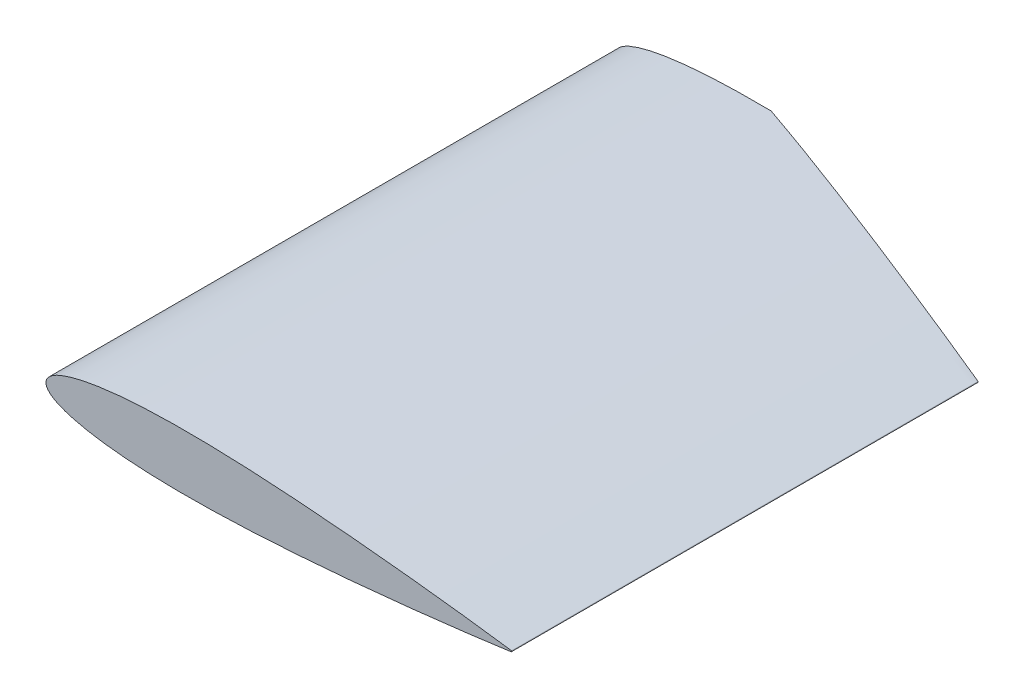
ISO-10303-21;
HEADER;
FILE_DESCRIPTION(('STEP AP214'),'2;1');
FILE_NAME('part.step','',(''),(''),'','','');
FILE_SCHEMA(('AUTOMOTIVE_DESIGN { 1 0 10303 214 1 1 1 1 }'));
ENDSEC;
DATA;
#1=APPLICATION_CONTEXT('core data for automotive mechanical design processes');
#2=APPLICATION_PROTOCOL_DEFINITION('international standard','automotive_design',2000,#1);
#3=PRODUCT_CONTEXT('',#1,'mechanical');
#4=PRODUCT('Part','Part','',(#3));
#5=PRODUCT_RELATED_PRODUCT_CATEGORY('part','',(#4));
#6=PRODUCT_DEFINITION_FORMATION('','',#4);
#7=PRODUCT_DEFINITION_CONTEXT('part definition',#1,'design');
#8=PRODUCT_DEFINITION('design','',#6,#7);
#9=PRODUCT_DEFINITION_SHAPE('','',#8);
#10=(LENGTH_UNIT() NAMED_UNIT(*) SI_UNIT(.MILLI.,.METRE.));
#11=(NAMED_UNIT(*) PLANE_ANGLE_UNIT() SI_UNIT($,.RADIAN.));
#12=(NAMED_UNIT(*) SI_UNIT($,.STERADIAN.) SOLID_ANGLE_UNIT());
#13=UNCERTAINTY_MEASURE_WITH_UNIT(LENGTH_MEASURE(1.E-05),#10,'distance_accuracy_value','');
#14=(GEOMETRIC_REPRESENTATION_CONTEXT(3) GLOBAL_UNCERTAINTY_ASSIGNED_CONTEXT((#13)) GLOBAL_UNIT_ASSIGNED_CONTEXT((#10,
#11,#12)) REPRESENTATION_CONTEXT('',''));
#15=CARTESIAN_POINT('',(0.,0.,0.));
#16=DIRECTION('',(0.,0.,1.));
#17=DIRECTION('',(1.,0.,0.));
#18=AXIS2_PLACEMENT_3D('',#15,#16,#17);
#19=CARTESIAN_POINT('',(0.,0.,279.908));
#20=CARTESIAN_POINT('',(0.,-0.328477994016476,279.908));
#21=CARTESIAN_POINT('',(0.0941325441731211,-1.0023172729545,279.908));
#22=CARTESIAN_POINT('',(0.516328798870607,-1.97904766428281,279.908));
#23=CARTESIAN_POINT('',(1.2062530836688,-2.91908428586532,279.908));
#24=CARTESIAN_POINT('',(2.15553029214511,-3.82650713523624,279.908));
#25=CARTESIAN_POINT('',(3.36108897823794,-4.704503454001,279.908));
#26=CARTESIAN_POINT('',(4.82117378549371,-5.55391213037572,279.908));
#27=CARTESIAN_POINT('',(6.53364786433014,-6.37376807619808,279.908));
#28=CARTESIAN_POINT('',(8.495474964745,-7.16221285278309,279.908));
#29=CARTESIAN_POINT('',(10.702763054413,-7.9168996406346,279.908));
#30=CARTESIAN_POINT('',(13.1508009680241,-8.63530008315857,279.908));
#31=CARTESIAN_POINT('',(15.8342010039548,-9.31470759905576,279.908));
#32=CARTESIAN_POINT('',(18.746872000712,-9.95265574754795,279.908));
#33=CARTESIAN_POINT('',(21.8821858066414,-10.5465238380771,279.908));
#34=CARTESIAN_POINT('',(25.2328944597636,-11.0941511442518,279.908));
#35=CARTESIAN_POINT('',(28.7912646586481,-11.5932902144363,279.908));
#36=CARTESIAN_POINT('',(32.5490198428833,-12.0422559820197,279.908));
#37=CARTESIAN_POINT('',(36.4974269002736,-12.4394447399889,279.908));
#38=CARTESIAN_POINT('',(40.6272789510416,-12.7837513145914,279.908));
#39=CARTESIAN_POINT('',(44.9289529771962,-13.0743792747522,279.908));
#40=CARTESIAN_POINT('',(49.3924277623496,-13.3108406664919,279.908));
#41=CARTESIAN_POINT('',(54.0072816695019,-13.4931883216709,279.908));
#42=CARTESIAN_POINT('',(58.7627401496173,-13.6217631243166,279.908));
#43=CARTESIAN_POINT('',(63.6477053289908,-13.6972676587605,279.908));
#44=CARTESIAN_POINT('',(68.6507801727426,-13.7208707598036,279.908));
#45=CARTESIAN_POINT('',(73.7602795136408,-13.6939838315269,279.908));
#46=CARTESIAN_POINT('',(78.9642730593178,-13.6183651311604,279.908));
#47=CARTESIAN_POINT('',(84.2506096510007,-13.4960636219202,279.908));
#48=CARTESIAN_POINT('',(89.6069569121045,-13.3294041245673,279.908));
#49=CARTESIAN_POINT('',(95.0208042259306,-13.1208208391039,279.908));
#50=CARTESIAN_POINT('',(100.479505937248,-12.8729972701357,279.908));
#51=CARTESIAN_POINT('',(105.970317865327,-12.5887462656741,279.908));
#52=CARTESIAN_POINT('',(111.480424998855,-12.2709314674917,279.908));
#53=CARTESIAN_POINT('',(116.99696065362,-11.9225054491796,279.908));
#54=CARTESIAN_POINT('',(122.507041698154,-11.5464309162635,279.908));
#55=CARTESIAN_POINT('',(127.997806047768,-11.1456605982077,279.908));
#56=CARTESIAN_POINT('',(133.456428211459,-10.7231985761213,279.908));
#57=CARTESIAN_POINT('',(138.870163216828,-10.2818717518472,279.908));
#58=CARTESIAN_POINT('',(144.226358514157,-9.82456304442637,279.908));
#59=CARTESIAN_POINT('',(149.512524458663,-9.35404412678087,279.908));
#60=CARTESIAN_POINT('',(154.716299800482,-8.87302061589386,279.908));
#61=CARTESIAN_POINT('',(159.825543846758,-8.38419190518217,279.908));
#62=CARTESIAN_POINT('',(164.828306857754,-7.89004554213165,279.908));
#63=CARTESIAN_POINT('',(169.71292800753,-7.39314819793037,279.908));
#64=CARTESIAN_POINT('',(174.467978147504,-6.89591580791378,279.908));
#65=CARTESIAN_POINT('',(179.082363680661,-6.40079333268682,279.908));
#66=CARTESIAN_POINT('',(183.545298008656,-5.91018942974059,279.908));
#67=CARTESIAN_POINT('',(187.846354056406,-5.426302321017,279.908));
#68=CARTESIAN_POINT('',(191.975503596944,-4.95159079608177,279.908));
#69=CARTESIAN_POINT('',(195.92309473637,-4.48826239760994,279.908));
#70=CARTESIAN_POINT('',(199.679907253226,-4.03859351271151,279.908));
#71=CARTESIAN_POINT('',(203.23715632793,-3.60479978327037,279.908));
#72=CARTESIAN_POINT('',(206.586548752711,-3.18915507911661,279.908));
#73=CARTESIAN_POINT('',(209.720252988558,-2.79375491607679,279.908));
#74=CARTESIAN_POINT('',(212.630956022205,-2.42081086327762,279.908));
#75=CARTESIAN_POINT('',(215.311847817203,-2.07224105422639,279.908));
#76=CARTESIAN_POINT('',(217.756675720222,-1.75016863484946,279.908));
#77=CARTESIAN_POINT('',(219.959752272128,-1.45638360001213,279.908));
#78=CARTESIAN_POINT('',(221.91584559381,-1.19254519364725,279.908));
#79=CARTESIAN_POINT('',(223.620666071263,-0.960790621537402,279.908));
#80=CARTESIAN_POINT('',(225.069395853676,-0.760875596409357,279.908));
#81=CARTESIAN_POINT('',(226.261037982805,-0.598983786818424,279.908));
#82=CARTESIAN_POINT('',(227.186433997488,-0.462932703818933,279.908));
#83=CARTESIAN_POINT('',(227.85890667084,-0.385743814996746,279.908));
#84=CARTESIAN_POINT('',(228.245225393115,-0.302214543061352,279.908));
#85=CARTESIAN_POINT('',(228.641481893181,-0.309763382509555,279.908));
#86=CARTESIAN_POINT('',(228.641481893181,0.309763382513072,279.908));
#87=CARTESIAN_POINT('',(228.245225393115,0.302214543064814,279.908));
#88=CARTESIAN_POINT('',(227.85890667084,0.385743815000233,279.908));
#89=CARTESIAN_POINT('',(227.186433997488,0.462932703822383,279.908));
#90=CARTESIAN_POINT('',(226.261037982805,0.598983786821878,279.908));
#91=CARTESIAN_POINT('',(225.069395853676,0.760875596412778,279.908));
#92=CARTESIAN_POINT('',(223.620666071263,0.960790621540818,279.908));
#93=CARTESIAN_POINT('',(221.91584559381,1.19254519365062,279.908));
#94=CARTESIAN_POINT('',(219.959752272128,1.45638360001549,279.908));
#95=CARTESIAN_POINT('',(217.756675720222,1.75016863485277,279.908));
#96=CARTESIAN_POINT('',(215.311847817203,2.07224105422966,279.908));
#97=CARTESIAN_POINT('',(212.630956022205,2.42081086328087,279.908));
#98=CARTESIAN_POINT('',(209.720252988558,2.79375491607998,279.908));
#99=CARTESIAN_POINT('',(206.586548752711,3.18915507911975,279.908));
#100=CARTESIAN_POINT('',(203.23715632793,3.60479978327347,279.908));
#101=CARTESIAN_POINT('',(199.679907253226,4.03859351271456,279.908));
#102=CARTESIAN_POINT('',(195.92309473637,4.48826239761293,279.908));
#103=CARTESIAN_POINT('',(191.975503596944,4.9515907960847,279.908));
#104=CARTESIAN_POINT('',(187.846354056406,5.42630232101987,279.908));
#105=CARTESIAN_POINT('',(183.545298008656,5.91018942974339,279.908));
#106=CARTESIAN_POINT('',(179.082363680661,6.40079333268955,279.908));
#107=CARTESIAN_POINT('',(174.467978147504,6.89591580791643,279.908));
#108=CARTESIAN_POINT('',(169.71292800753,7.39314819793296,279.908));
#109=CARTESIAN_POINT('',(164.828306857754,7.89004554213415,279.908));
#110=CARTESIAN_POINT('',(159.825543846758,8.3841919051846,279.908));
#111=CARTESIAN_POINT('',(154.716299800482,8.87302061589623,279.908));
#112=CARTESIAN_POINT('',(149.512524458662,9.35404412678314,279.908));
#113=CARTESIAN_POINT('',(144.226358514157,9.82456304442856,279.908));
#114=CARTESIAN_POINT('',(138.870163216828,10.2818717518493,279.908));
#115=CARTESIAN_POINT('',(133.456428211459,10.7231985761234,279.908));
#116=CARTESIAN_POINT('',(127.997806047768,11.1456605982096,279.908));
#117=CARTESIAN_POINT('',(122.507041698154,11.5464309162653,279.908));
#118=CARTESIAN_POINT('',(116.996960653619,11.9225054491814,279.908));
#119=CARTESIAN_POINT('',(111.480424998854,12.2709314674934,279.908));
#120=CARTESIAN_POINT('',(105.970317865327,12.5887462656757,279.908));
#121=CARTESIAN_POINT('',(100.479505937248,12.8729972701372,279.908));
#122=CARTESIAN_POINT('',(95.0208042259304,13.1208208391053,279.908));
#123=CARTESIAN_POINT('',(89.6069569121043,13.3294041245687,279.908));
#124=CARTESIAN_POINT('',(84.2506096510005,13.4960636219214,279.908));
#125=CARTESIAN_POINT('',(78.9642730593176,13.6183651311616,279.908));
#126=CARTESIAN_POINT('',(73.7602795136406,13.693983831528,279.908));
#127=CARTESIAN_POINT('',(68.6507801727424,13.7208707598047,279.908));
#128=CARTESIAN_POINT('',(63.6477053289906,13.6972676587614,279.908));
#129=CARTESIAN_POINT('',(58.7627401496171,13.6217631243175,279.908));
#130=CARTESIAN_POINT('',(54.0072816695016,13.4931883216718,279.908));
#131=CARTESIAN_POINT('',(49.3924277623495,13.3108406664926,279.908));
#132=CARTESIAN_POINT('',(44.928952977196,13.0743792747529,279.908));
#133=CARTESIAN_POINT('',(40.6272789510414,12.783751314592,279.908));
#134=CARTESIAN_POINT('',(36.4974269002734,12.4394447399895,279.908));
#135=CARTESIAN_POINT('',(32.5490198428832,12.0422559820202,279.908));
#136=CARTESIAN_POINT('',(28.7912646586479,11.5932902144368,279.908));
#137=CARTESIAN_POINT('',(25.2328944597635,11.0941511442522,279.908));
#138=CARTESIAN_POINT('',(21.8821858066412,10.5465238380774,279.908));
#139=CARTESIAN_POINT('',(18.7468720007118,9.95265574754821,279.908));
#140=CARTESIAN_POINT('',(15.8342010039546,9.31470759905599,279.908));
#141=CARTESIAN_POINT('',(13.150800968024,8.63530008315877,279.908));
#142=CARTESIAN_POINT('',(10.7027630544128,7.91689964063473,279.908));
#143=CARTESIAN_POINT('',(8.49547496474492,7.16221285278321,279.908));
#144=CARTESIAN_POINT('',(6.53364786433,6.37376807619818,279.908));
#145=CARTESIAN_POINT('',(4.82117378549363,5.55391213037578,279.908));
#146=CARTESIAN_POINT('',(3.36108897823788,4.70450345400106,279.908));
#147=CARTESIAN_POINT('',(2.15553029214511,3.8265071352363,279.908));
#148=CARTESIAN_POINT('',(1.20625308366877,2.9190842858653,279.908));
#149=CARTESIAN_POINT('',(0.516328798870579,1.97904766428281,279.908));
#150=CARTESIAN_POINT('',(0.094132544173121,1.00231727295449,279.908));
#151=CARTESIAN_POINT('',(0.,0.328477994016488,279.908));
#152=CARTESIAN_POINT('',(0.,0.,279.908));
#153=B_SPLINE_CURVE_WITH_KNOTS('',3,(#19,#20,#21,#22,#23,#24,#25,#26,#27,#28,#29,#30,#31,#32,
#33,#34,#35,#36,#37,#38,#39,#40,#41,#42,#43,#44,#45,#46,#47,#48,#49,#50,#51,#52,#53,#54,#55,#56,
#57,#58,#59,#60,#61,#62,#63,#64,#65,#66,#67,#68,#69,#70,#71,#72,#73,#74,#75,#76,#77,#78,#79,#80,
#81,#82,#83,#84,#85,#86,#87,#88,#89,#90,#91,#92,#93,#94,#95,#96,#97,#98,#99,#100,#101,#102,#103,
#104,#105,#106,#107,#108,#109,#110,#111,#112,#113,#114,#115,#116,#117,#118,#119,#120,#121,#122,
#123,#124,#125,#126,#127,#128,#129,#130,#131,#132,#133,#134,#135,#136,#137,#138,#139,#140,#141,
#142,#143,#144,#145,#146,#147,#148,#149,#150,#151,#152),.UNSPECIFIED.,.T.,.F.,(4,1,1,1,1,1,1,1,
1,1,1,1,1,1,1,1,1,1,1,1,1,1,1,1,1,1,1,1,1,1,1,1,1,1,1,1,1,1,1,1,1,1,1,1,1,1,1,1,1,1,1,1,1,1,1,1,
1,1,1,1,1,1,1,1,1,1,1,1,1,1,1,1,1,1,1,1,1,1,1,1,1,1,1,1,1,1,1,1,1,1,1,1,1,1,1,1,1,1,1,1,1,1,1,1,
1,1,1,1,1,1,1,1,1,1,1,1,1,1,1,1,1,1,1,1,1,1,1,1,1,1,1,4),(0.,0.00210616807074115,
0.00432059011551111,0.00677278324255004,0.0095566969740557,0.0127340412762951,0.016342887665016,
0.0204056041416188,0.0249341021959062,0.0299330711387399,0.0354022405625184,0.0413374297387623,
0.0477315899593609,0.0545753893368606,0.0618574049639954,0.0695645708943233,0.0776823107915671,
0.0861946839628209,0.0950844406286816,0.104333244082668,0.11392170016525,0.123829338817381,
0.134034707587743,0.144515530837606,0.155248716244455,0.166210355911424,0.177375782785101,
0.188719821086083,0.200216647190567,0.211839950659802,0.223562989450439,0.235358652726913,
0.247199624742581,0.259058395239763,0.270907226000352,0.28271845684065,0.294464514017973,
0.306117689175103,0.317650770640405,0.329036618137891,0.340248510387813,0.351259999107984,
0.362045273287995,0.372578891011839,0.382836142378724,0.392792739452293,0.402425320157517,
0.411711114815343,0.420628244391039,0.429155672678663,0.437273179489273,0.444961560956889,
0.452202574975458,0.458979062595132,0.465274875652064,0.471074962819879,0.4763655692602,
0.481133960582339,0.485368767772863,0.489059784178549,0.492198147958178,0.494776266124308,
0.496788010026555,0.49822842540793,0.499094072926926,0.499382862053181,0.500617137946819,
0.500905927073075,0.50177157459207,0.503211989973446,0.505223733875692,0.507801852041822,
0.510940215821451,0.514631232227138,0.518866039417661,0.5236344307398,0.528925037180122,
0.534725124347937,0.541020937404868,0.547797425024542,0.555038439043111,0.562726820510727,
0.570844327321338,0.579371755608962,0.588288885184657,0.597574679842483,0.607207260547707,
0.617163857621276,0.627421108988161,0.637954726712006,0.648740000892016,0.659751489612187,
0.670963381862109,0.682349229359595,0.693882310824897,0.705535485982027,0.717281543159351,
0.729092773999648,0.740941604760238,0.752800375257419,0.764641347273087,0.776437010549561,
0.788160049340198,0.799783352809433,0.811280178913917,0.822624217214899,0.833789644088576,
0.844751283755546,0.855484469162394,0.865965292412258,0.876170661182619,0.88607829983475,
0.895666755917333,0.904915559371319,0.913805316037179,0.922317689208433,0.930435429105677,
0.938142595036005,0.94542461066314,0.952268410040639,0.958662570261238,0.964597759437482,
0.97006692886126,0.975065897804094,0.979594395858381,0.983657112334984,0.987265958723705,
0.990443303025944,0.99322721675745,0.995679409884489,0.997893831929259,1.),.UNSPECIFIED.);
#154=DIRECTION('',(0.,0.,-1.));
#155=VECTOR('',#154,1.);
#156=SURFACE_OF_LINEAR_EXTRUSION('',#153,#155);
#157=CARTESIAN_POINT('',(0.,0.,279.908));
#158=VERTEX_POINT('',#157);
#159=EDGE_CURVE('E11',#158,#158,#153,.T.);
#160=ORIENTED_EDGE('',*,*,#159,.F.);
#161=EDGE_LOOP('',(#160));
#162=FACE_BOUND('',#161,.T.);
#163=CARTESIAN_POINT('',(76.1999999999999,-13.6565628102421,0.));
#164=CARTESIAN_POINT('',(77.208840666088,-13.6422333763701,0.336280222029334));
#165=CARTESIAN_POINT('',(78.2176454511476,-13.625283053911,0.672548483715867));
#166=CARTESIAN_POINT('',(80.2351660077787,-13.5863996079713,1.34505533592625));
#167=CARTESIAN_POINT('',(81.2438817795875,-13.5644664981958,1.68129392652917));
#168=CARTESIAN_POINT('',(84.2698417804683,-13.4915821819853,2.68994726015614));
#169=CARTESIAN_POINT('',(86.2869349438838,-13.4335454551973,3.36231164796129));
#170=CARTESIAN_POINT('',(90.3199423603291,-13.3003887923855,4.70664745344305));
#171=CARTESIAN_POINT('',(92.3358567829152,-13.225274479899,5.37861892763841));
#172=CARTESIAN_POINT('',(96.3671178610413,-13.0595174609881,6.72237262034712));
#173=CARTESIAN_POINT('',(98.3824645138563,-12.9688746812659,7.39415483795213));
#174=CARTESIAN_POINT('',(102.412271061332,-12.7734622632592,8.73742368711053));
#175=CARTESIAN_POINT('',(104.426731038136,-12.6686944996075,9.40891034604533));
#176=CARTESIAN_POINT('',(108.455009599191,-12.4462142902764,10.751669866397));
#177=CARTESIAN_POINT('',(110.468828181584,-12.3285018074345,11.4229427271946));
#178=CARTESIAN_POINT('',(116.509179769497,-11.9575825032013,13.4363932564991));
#179=CARTESIAN_POINT('',(120.534736152306,-11.6865875009648,14.778245384102));
#180=CARTESIAN_POINT('',(128.583244433655,-11.104170990864,17.4610814778849));
#181=CARTESIAN_POINT('',(132.606196292894,-10.7927488866371,18.8020654309647));
#182=CARTESIAN_POINT('',(140.647518428989,-10.1348177282568,21.4825061429963));
#183=CARTESIAN_POINT('',(144.665889986617,-9.78832603770965,22.8219633288723));
#184=CARTESIAN_POINT('',(150.691618125074,-9.24494154838238,24.8305393750247));
#185=CARTESIAN_POINT('',(152.699942277845,-9.05986703043822,25.4999807592816));
#186=CARTESIAN_POINT('',(156.715952077228,-8.68217531265046,26.8386506924094));
#187=CARTESIAN_POINT('',(158.723637723845,-8.48955811285208,27.5078792412817));
#188=CARTESIAN_POINT('',(164.745848138022,-7.90076942791547,29.515282712674));
#189=CARTESIAN_POINT('',(168.759417169468,-7.49367073580834,30.8531390564892));
#190=CARTESIAN_POINT('',(174.777777238214,-6.86211008095231,32.8592590794047));
#191=CARTESIAN_POINT('',(176.783563264592,-6.64810462250083,33.5278544215308));
#192=CARTESIAN_POINT('',(180.794459537586,-6.21317182808128,34.864819845862));
#193=CARTESIAN_POINT('',(182.799569784735,-5.99224449759606,35.5331899282451));
#194=CARTESIAN_POINT('',(186.809012361799,-5.54341690293842,36.8696707872664));
#195=CARTESIAN_POINT('',(188.813344717737,-5.31551689689992,37.5377815725789));
#196=CARTESIAN_POINT('',(192.821278678686,-4.8526979416782,38.873759559562));
#197=CARTESIAN_POINT('',(194.824880284422,-4.61777899947017,39.5416267614741));
#198=CARTESIAN_POINT('',(197.711818692563,-4.27403452151866,40.5039395641875));
#199=CARTESIAN_POINT('',(198.595467037055,-4.16810963129345,40.7984890123515));
#200=CARTESIAN_POINT('',(200.362603092899,-3.95483913933565,41.3875343642996));
#201=CARTESIAN_POINT('',(201.246090805357,-3.84749354778988,41.6820302684522));
#202=CARTESIAN_POINT('',(203.012910870883,-3.63137330523459,42.2709702902942));
#203=CARTESIAN_POINT('',(203.896243223604,-3.52259865107481,42.565414407868));
#204=CARTESIAN_POINT('',(205.662746929352,-3.30359201490094,43.1542489764506));
#205=CARTESIAN_POINT('',(206.545918282085,-3.19336003025714,43.4486394273616));
#206=CARTESIAN_POINT('',(208.607848038132,-2.93425428063051,44.1359493460437));
#207=CARTESIAN_POINT('',(209.78654118152,-2.784803095191,44.5288470605068));
#208=CARTESIAN_POINT('',(212.143615559526,-2.4831966899373,45.314538519842));
#209=CARTESIAN_POINT('',(213.321996794298,-2.33104147147488,45.7073322647661));
#210=CARTESIAN_POINT('',(215.286173951022,-2.07507737679268,46.3620579836741));
#211=CARTESIAN_POINT('',(216.072060152018,-1.9720376059638,46.6240200506727));
#212=CARTESIAN_POINT('',(217.643686099765,-1.76472471940942,47.1478953665884));
#213=CARTESIAN_POINT('',(218.429425846538,-1.66045160386557,47.4098086155126));
#214=CARTESIAN_POINT('',(219.73895491094,-1.48553883842829,47.8463183036466));
#215=CARTESIAN_POINT('',(220.262788767302,-1.41526953047994,48.0209295891007));
#216=CARTESIAN_POINT('',(221.310390785502,-1.27418561286308,48.370130261834));
#217=CARTESIAN_POINT('',(221.834158947285,-1.20337100274243,48.5447196490949));
#218=CARTESIAN_POINT('',(222.707007391959,-1.08493931904569,48.8356691306531));
#219=CARTESIAN_POINT('',(223.056104494545,-1.03746022659085,48.9520348315149));
#220=CARTESIAN_POINT('',(223.754235500923,-0.942002182192941,49.1847451669742));
#221=CARTESIAN_POINT('',(224.103269405002,-0.894023232577651,49.3010898016673));
#222=CARTESIAN_POINT('',(224.684926838106,-0.814086306894115,49.494975612702));
#223=CARTESIAN_POINT('',(224.917549603426,-0.782122114268486,49.5725165344754));
#224=CARTESIAN_POINT('',(225.382830778411,-0.718452920805785,49.7276102594702));
#225=CARTESIAN_POINT('',(225.615489188579,-0.686747924058714,49.8051630628595));
#226=CARTESIAN_POINT('',(226.003083371146,-0.633224553023536,49.9343611237153));
#227=CARTESIAN_POINT('',(226.15804761288,-0.611637506393094,49.9860158709601));
#228=CARTESIAN_POINT('',(226.467866160496,-0.567679065661751,50.0892887201654));
#229=CARTESIAN_POINT('',(226.622720472554,-0.545307719891686,50.1409068241847));
#230=CARTESIAN_POINT('',(226.829272525194,-0.516080290116077,50.209757508398));
#231=CARTESIAN_POINT('',(226.880918966183,-0.508823270425826,50.2269729887277));
#232=CARTESIAN_POINT('',(226.984233421107,-0.494484149451267,50.2614111403688));
#233=CARTESIAN_POINT('',(227.035901434916,-0.487402047165571,50.2786338116386));
#234=CARTESIAN_POINT('',(227.139276078933,-0.473465131854073,50.3130920263109));
#235=CARTESIAN_POINT('',(227.190982714902,-0.466610365936756,50.330327571634));
#236=CARTESIAN_POINT('',(227.294435194721,-0.453237159809118,50.3648117315738));
#237=CARTESIAN_POINT('',(227.346181038771,-0.446718721318177,50.382060346257));
#238=CARTESIAN_POINT('',(227.432228730006,-0.435894960614488,50.4107429100019));
#239=CARTESIAN_POINT('',(227.466530001711,-0.431584420764409,50.4221766672369));
#240=CARTESIAN_POINT('',(227.535118244768,-0.422839930331956,50.4450394149226));
#241=CARTESIAN_POINT('',(227.569405216114,-0.418405979701031,50.4564684053715));
#242=CARTESIAN_POINT('',(227.672184270711,-0.404753119596681,50.4907280902372));
#243=CARTESIAN_POINT('',(227.740635897022,-0.395178283909059,50.5135452990073));
#244=CARTESIAN_POINT('',(227.855032924966,-0.377487366197331,50.5516776416553));
#245=CARTESIAN_POINT('',(227.901051782002,-0.36991088444401,50.5670172606675));
#246=CARTESIAN_POINT('',(227.992954500605,-0.35358182121007,50.5976515002018));
#247=CARTESIAN_POINT('',(228.038838140671,-0.344827871388667,50.6129460468904));
#248=CARTESIAN_POINT('',(228.115823317597,-0.331360190155136,50.6386077725325));
#249=CARTESIAN_POINT('',(228.146862046987,-0.326260282502573,50.6489540156623));
#250=CARTESIAN_POINT('',(228.209047004748,-0.317435451264139,50.669682334916));
#251=CARTESIAN_POINT('',(228.240192753138,-0.313707034218769,50.6800642510461));
#252=CARTESIAN_POINT('',(228.280995417128,-0.31013985966804,50.6936651390425));
#253=CARTESIAN_POINT('',(228.290582688591,-0.309396354272701,50.6968608961971));
#254=CARTESIAN_POINT('',(228.309768199644,-0.308101827986706,50.7032560665481));
#255=CARTESIAN_POINT('',(228.319366437671,-0.307550782454564,50.7064554792236));
#256=CARTESIAN_POINT('',(228.338611625414,-0.306693759487192,50.7128705418045));
#257=CARTESIAN_POINT('',(228.348258613477,-0.306388796296355,50.7160862044923));
#258=CARTESIAN_POINT('',(228.367553840502,-0.305820489108642,50.722517946834));
#259=CARTESIAN_POINT('',(228.377202079499,-0.305557146827256,50.7257340264998));
#260=CARTESIAN_POINT('',(228.398580775815,-0.304554059674235,50.732860258605));
#261=CARTESIAN_POINT('',(228.410308427668,-0.30372328080771,50.7367694758895));
#262=CARTESIAN_POINT('',(228.43357670037,-0.300703128041631,50.7445255667899));
#263=CARTESIAN_POINT('',(228.445118029402,-0.298522189846027,50.7483726764675));
#264=CARTESIAN_POINT('',(228.464386424908,-0.292689237949018,50.7547954749692));
#265=CARTESIAN_POINT('',(228.47226415437,-0.289632602445448,50.7574213847899));
#266=CARTESIAN_POINT('',(228.487338168823,-0.282004686824539,50.7624460562743));
#267=CARTESIAN_POINT('',(228.494534250587,-0.277432956812174,50.7648447501957));
#268=CARTESIAN_POINT('',(228.508054114492,-0.267127915226009,50.7693513714973));
#269=CARTESIAN_POINT('',(228.514382518338,-0.26140119446391,50.7714608394461));
#270=CARTESIAN_POINT('',(228.526198817587,-0.249044771703372,50.7753996058623));
#271=CARTESIAN_POINT('',(228.531685050339,-0.242413331079536,50.7772283501129));
#272=CARTESIAN_POINT('',(228.545267011796,-0.223840004856945,50.7817556705988));
#273=CARTESIAN_POINT('',(228.552646340867,-0.211318477334253,50.7842154469556));
#274=CARTESIAN_POINT('',(228.565529280599,-0.185229332976911,50.7885097601997));
#275=CARTESIAN_POINT('',(228.571024928385,-0.171657565458602,50.790341642795));
#276=CARTESIAN_POINT('',(228.584280159487,-0.132641956051129,50.7947600531623));
#277=CARTESIAN_POINT('',(228.590243746039,-0.106522938535659,50.7967479153465));
#278=CARTESIAN_POINT('',(228.598110856215,-0.0536032831325101,50.799370285405));
#279=CARTESIAN_POINT('',(228.60000090948,-0.0268006794385224,50.8000003031601));
#280=CARTESIAN_POINT('',(228.599999151841,0.0249936502658953,50.7999997172804));
#281=CARTESIAN_POINT('',(228.598353739826,0.0499856270133849,50.7994512466088));
#282=CARTESIAN_POINT('',(228.591541306871,0.099389634042865,50.7971804356238));
#283=CARTESIAN_POINT('',(228.586387783343,0.123803517322018,50.7954625944475));
#284=CARTESIAN_POINT('',(228.575125354313,0.160270466765427,50.7917084514375));
#285=CARTESIAN_POINT('',(228.570543655207,0.172848411869609,50.7901812184022));
#286=CARTESIAN_POINT('',(228.559894799591,0.197274451085241,50.7866315998636));
#287=CARTESIAN_POINT('',(228.553831346166,0.209124273871863,50.7846104487221));
#288=CARTESIAN_POINT('',(228.541463326275,0.229179952627646,50.780487775425));
#289=CARTESIAN_POINT('',(228.535499950574,0.237616794854434,50.7784999835247));
#290=CARTESIAN_POINT('',(228.522384163456,0.25339898829607,50.7741280544854));
#291=CARTESIAN_POINT('',(228.515233602208,0.260746004731027,50.7717445340689));
#292=CARTESIAN_POINT('',(228.501034154246,0.272765195390341,50.7670113847486));
#293=CARTESIAN_POINT('',(228.494172922037,0.27767962975641,50.7647243073462));
#294=CARTESIAN_POINT('',(228.483359783279,0.28401808953392,50.7611199277595));
#295=CARTESIAN_POINT('',(228.479674777169,0.285956450748664,50.759891592389));
#296=CARTESIAN_POINT('',(228.472150396362,0.28946871888315,50.7573834654546));
#297=CARTESIAN_POINT('',(228.468310980789,0.291042528539457,50.7561036602649));
#298=CARTESIAN_POINT('',(228.458675444279,0.294530122112458,50.7528918147626));
#299=CARTESIAN_POINT('',(228.45281667935,0.296249945834225,50.7509388931173));
#300=CARTESIAN_POINT('',(228.44097650858,0.299120405628172,50.746992169526));
#301=CARTESIAN_POINT('',(228.434995013927,0.300270613194885,50.7449983379754));
#302=CARTESIAN_POINT('',(228.422908951763,0.302157220222232,50.7409696505879));
#303=CARTESIAN_POINT('',(228.416803754392,0.3028889194981,50.7389345847973));
#304=CARTESIAN_POINT('',(228.404568959953,0.304053016016183,50.7348563199842));
#305=CARTESIAN_POINT('',(228.398439360501,0.3044853832587,50.732813120167));
#306=CARTESIAN_POINT('',(228.382607710774,0.305361849938137,50.7275359035914));
#307=CARTESIAN_POINT('',(228.372899702542,0.305666743287848,50.7242999008474));
#308=CARTESIAN_POINT('',(228.353482628381,0.306239413538377,50.7178275427938));
#309=CARTESIAN_POINT('',(228.343773562455,0.306507186304697,50.714591187485));
#310=CARTESIAN_POINT('',(228.324371315524,0.307294912157175,50.7081237718413));
#311=CARTESIAN_POINT('',(228.314678128029,0.307814665738577,50.7048927093431));
#312=CARTESIAN_POINT('',(228.295303295697,0.309053244069,50.6984344318989));
#313=CARTESIAN_POINT('',(228.285621651525,0.30977207980916,50.6952072171751));
#314=CARTESIAN_POINT('',(228.256610247764,0.312218391566469,50.6855367492546));
#315=CARTESIAN_POINT('',(228.237302049034,0.314236200190707,50.6791006830115));
#316=CARTESIAN_POINT('',(228.19890127794,0.318881518498393,50.6663004259799));
#317=CARTESIAN_POINT('',(228.179808176353,0.321504325684572,50.6599360587843));
#318=CARTESIAN_POINT('',(228.141662519093,0.327216594837979,50.6472208396977));
#319=CARTESIAN_POINT('',(228.122610039322,0.330306611693899,50.6408700131072));
#320=CARTESIAN_POINT('',(228.084539360946,0.33678626830337,50.6281797869821));
#321=CARTESIAN_POINT('',(228.065521192496,0.340176100607759,50.6218403974985));
#322=CARTESIAN_POINT('',(228.00848385936,0.350516055672115,50.60282795312));
#323=CARTESIAN_POINT('',(227.970492104566,0.357634905074791,50.5901640348553));
#324=CARTESIAN_POINT('',(227.894395908249,0.370999217692253,50.5647986360832));
#325=CARTESIAN_POINT('',(227.856291563216,0.377245283537614,50.5520971877388));
#326=CARTESIAN_POINT('',(227.780006842222,0.389126865364915,50.5266689474073));
#327=CARTESIAN_POINT('',(227.741826482384,0.394762499154743,50.5139421607947));
#328=CARTESIAN_POINT('',(227.665316569206,0.405593248297943,50.4884388564018));
#329=CARTESIAN_POINT('',(227.626986877707,0.410787274109961,50.475662292569));
#330=CARTESIAN_POINT('',(227.550285911943,0.420900644800552,50.450095303981));
#331=CARTESIAN_POINT('',(227.511914629839,0.425819922659009,50.437304876613));
#332=CARTESIAN_POINT('',(227.43515558862,0.435540024099993,50.41171852954));
#333=CARTESIAN_POINT('',(227.396767828433,0.440340838186904,50.3989226094777));
#334=CARTESIAN_POINT('',(227.300895641824,0.452437516311237,50.3669652139414));
#335=CARTESIAN_POINT('',(227.243417075064,0.459785810107771,50.3478056916881));
#336=CARTESIAN_POINT('',(227.128510516743,0.474873929116894,50.309503505581));
#337=CARTESIAN_POINT('',(227.071082521743,0.482613725219695,50.2903608405811));
#338=CARTESIAN_POINT('',(226.956293438624,0.498330263448775,50.2520978128746));
#339=CARTESIAN_POINT('',(226.898932331218,0.5063068503146,50.2329774437393));
#340=CARTESIAN_POINT('',(226.784229823702,0.522427346889305,50.1947432745673));
#341=CARTESIAN_POINT('',(226.726888424137,0.530571260899631,50.1756294747123));
#342=CARTESIAN_POINT('',(226.554861197174,0.55510680627651,50.1182870657248));
#343=CARTESIAN_POINT('',(226.440188425974,0.57159998558227,50.080062808658));
#344=CARTESIAN_POINT('',(226.210788784046,0.604162058612439,50.0035962613485));
#345=CARTESIAN_POINT('',(226.096061913424,0.620230953175341,49.9653539711414));
#346=CARTESIAN_POINT('',(225.866577646416,0.652113899028559,49.8888592154722));
#347=CARTESIAN_POINT('',(225.751820250343,0.667927952835955,49.8506067501142));
#348=CARTESIAN_POINT('',(225.522288405313,0.6994198148497,49.7740961351043));
#349=CARTESIAN_POINT('',(225.407513956321,0.715097622767006,49.7358379854404));
#350=CARTESIAN_POINT('',(225.063131846112,0.762197149603533,49.6210439487041));
#351=CARTESIAN_POINT('',(224.833531225947,0.793676016255905,49.5445104086489));
#352=CARTESIAN_POINT('',(224.374344326289,0.856754979166768,49.3914481087629));
#353=CARTESIAN_POINT('',(224.144758046838,0.88835507576379,49.314919348946));
#354=CARTESIAN_POINT('',(223.609056641789,0.961882687442321,49.1363522139297));
#355=CARTESIAN_POINT('',(223.30293317096,1.00374272056786,49.0343110569867));
#356=CARTESIAN_POINT('',(222.690649895711,1.08716638386971,48.8302166319038));
#357=CARTESIAN_POINT('',(222.384490091288,1.12873001401893,48.7281633637627));
#358=CARTESIAN_POINT('',(221.46598241738,1.25318298532353,48.4219941391267));
#359=CARTESIAN_POINT('',(220.853605527214,1.33583451111798,48.2178685090712));
#360=CARTESIAN_POINT('',(219.628754855742,1.50033380315013,47.8095849519142));
#361=CARTESIAN_POINT('',(219.016281074484,1.58218156976781,47.605427024828));
#362=CARTESIAN_POINT('',(217.79131396564,1.74508340442139,47.1971046552134));
#363=CARTESIAN_POINT('',(217.178820649421,1.82613756745335,46.9929402164738));
#364=CARTESIAN_POINT('',(215.953744541076,1.98749449131897,46.5845815136921));
#365=CARTESIAN_POINT('',(215.341161748895,2.06779725168343,46.3803872496316));
#366=CARTESIAN_POINT('',(214.115908408472,2.22765911475835,45.9719694694908));
#367=CARTESIAN_POINT('',(213.50323786016,2.30721821685518,45.7677459533867));
#368=CARTESIAN_POINT('',(210.439536463257,2.70317068683599,44.746512154419));
#369=CARTESIAN_POINT('',(207.987854225289,3.01398328954183,43.9292847417629));
#370=CARTESIAN_POINT('',(203.08322535456,3.6243838472541,42.2944084515199));
#371=CARTESIAN_POINT('',(200.630278717034,3.92397175963544,41.4767595723445));
#372=CARTESIAN_POINT('',(195.723207937525,4.51227563883308,39.8410693125083));
#373=CARTESIAN_POINT('',(193.269083793446,4.80099158622105,39.0230279311488));
#374=CARTESIAN_POINT('',(188.359254356974,5.36794901838436,37.3864181189914));
#375=CARTESIAN_POINT('',(185.903548847436,5.6461884128607,36.5678496158119));
#376=CARTESIAN_POINT('',(180.991096571267,6.19221056516476,34.9303655237557));
#377=CARTESIAN_POINT('',(178.53434980673,6.459993343908,34.1114499355767));
#378=CARTESIAN_POINT('',(173.619863065563,6.98516132221422,32.473287688521));
#379=CARTESIAN_POINT('',(171.162123091314,7.2425465465494,31.6540410304379));
#380=CARTESIAN_POINT('',(164.96282584935,7.87828003992437,29.5876086164499));
#381=CARTESIAN_POINT('',(161.220622918014,8.24965931218091,28.3402076393379));
#382=CARTESIAN_POINT('',(153.733973802635,8.96669689666321,25.8446579342117));
#383=CARTESIAN_POINT('',(149.989527604155,9.31235504152185,24.5965092013851));
#384=CARTESIAN_POINT('',(142.498298922494,9.97574364512776,22.0994329741647));
#385=CARTESIAN_POINT('',(138.751516377668,10.2934733326083,20.8505054592228));
#386=CARTESIAN_POINT('',(131.255442845097,10.897796547276,18.351814281699));
#387=CARTESIAN_POINT('',(127.506151713297,11.1843880979444,17.1020505710991));
#388=CARTESIAN_POINT('',(120.006602202181,11.7219884458587,14.6022007340602));
#389=CARTESIAN_POINT('',(116.25634463995,11.9730098506493,13.3521148799834));
#390=CARTESIAN_POINT('',(108.75357382337,12.4339281547369,10.8511912744567));
#391=CARTESIAN_POINT('',(105.001060601275,12.6438256286885,9.60035353375838));
#392=CARTESIAN_POINT('',(99.3708338229761,12.9223695056394,7.72361127432537));
#393=CARTESIAN_POINT('',(97.4939212400061,13.0091644250029,7.09797374666873));
#394=CARTESIAN_POINT('',(93.7395904897549,13.1695453627249,5.84653016325165));
#395=CARTESIAN_POINT('',(91.8621723243386,13.2431314291548,5.22072410811283));
#396=CARTESIAN_POINT('',(88.1070057694981,13.3758594744565,3.96900192316609));
#397=CARTESIAN_POINT('',(86.2292574120554,13.4350024559183,3.3430858040186));
#398=CARTESIAN_POINT('',(82.4733786174307,13.5374804499361,2.09112620581011));
#399=CARTESIAN_POINT('',(80.5952481833063,13.5808155843726,1.4650827277683));
#400=CARTESIAN_POINT('',(78.2974985723503,13.6231816141904,0.699166190783309));
#401=CARTESIAN_POINT('',(77.878010820683,13.6304819108069,0.559336940227638));
#402=CARTESIAN_POINT('',(77.0390174346263,13.6441939312854,0.279672478208823));
#403=CARTESIAN_POINT('',(76.6195118000867,13.6506056449412,0.13983726669566));
#404=CARTESIAN_POINT('',(76.1999999999999,13.6565628102433,0.));
#405=B_SPLINE_CURVE_WITH_KNOTS('',3,(#163,#164,#165,#166,#167,#168,#169,#170,#171,#172,#173,
#174,#175,#176,#177,#178,#179,#180,#181,#182,#183,#184,#185,#186,#187,#188,#189,#190,#191,#192,
#193,#194,#195,#196,#197,#198,#199,#200,#201,#202,#203,#204,#205,#206,#207,#208,#209,#210,#211,
#212,#213,#214,#215,#216,#217,#218,#219,#220,#221,#222,#223,#224,#225,#226,#227,#228,#229,#230,
#231,#232,#233,#234,#235,#236,#237,#238,#239,#240,#241,#242,#243,#244,#245,#246,#247,#248,#249,
#250,#251,#252,#253,#254,#255,#256,#257,#258,#259,#260,#261,#262,#263,#264,#265,#266,#267,#268,
#269,#270,#271,#272,#273,#274,#275,#276,#277,#278,#279,#280,#281,#282,#283,#284,#285,#286,#287,
#288,#289,#290,#291,#292,#293,#294,#295,#296,#297,#298,#299,#300,#301,#302,#303,#304,#305,#306,
#307,#308,#309,#310,#311,#312,#313,#314,#315,#316,#317,#318,#319,#320,#321,#322,#323,#324,#325,
#326,#327,#328,#329,#330,#331,#332,#333,#334,#335,#336,#337,#338,#339,#340,#341,#342,#343,#344,
#345,#346,#347,#348,#349,#350,#351,#352,#353,#354,#355,#356,#357,#358,#359,#360,#361,#362,#363,
#364,#365,#366,#367,#368,#369,#370,#371,#372,#373,#374,#375,#376,#377,#378,#379,#380,#381,#382,
#383,#384,#385,#386,#387,#388,#389,#390,#391,#392,#393,#394,#395,#396,#397,#398,#399,#400,#401,
#402,#403,#404),.UNSPECIFIED.,.F.,.F.,(4,2,2,2,2,2,2,2,2,2,2,2,2,2,2,2,2,2,2,2,2,2,2,2,2,2,2,2,
2,2,2,2,2,2,2,2,2,2,2,2,2,2,2,2,2,2,2,2,2,2,2,2,2,2,2,2,2,2,2,2,2,2,2,2,2,2,2,2,2,2,2,2,2,2,2,2,
2,2,2,2,2,2,2,2,2,2,2,2,2,2,2,2,2,2,2,2,2,2,2,2,2,2,2,2,2,2,2,2,2,2,2,2,2,2,2,2,2,2,2,2,4),(0.,
3.19051640547499,6.38102403564837,12.7619246600977,19.1407271311768,25.5195597124969,
31.8975465428791,38.2755516839958,51.0311582384657,63.7869529793954,76.5364626997878,
82.9115540297556,89.2866453215001,102.037174520645,108.412427989339,114.787676408302,
121.162689095473,127.537695447572,130.35004676632,133.16237793066,135.974715295593,
138.78705773597,142.541278571917,146.295497531146,148.799838135101,151.304178370204,
152.974046048384,154.643915111323,155.757007972435,156.870095652312,157.611937153844,
158.353790338812,158.848089630897,159.342358516152,159.507123381852,159.671887304067,
159.83668515789,160.001483854112,160.110721967765,160.219960124395,160.438304685091,
160.585579538551,160.733027043764,160.832353686297,160.931425542824,160.961823740552,
160.992218044836,161.022736990382,161.053257193498,161.090404930094,161.127322880451,
161.153733161319,161.180151291542,161.206422731122,161.232745387713,161.276715276469,
161.320868810441,161.400946442122,161.481288470769,161.556213458035,161.630851789732,
161.671192599799,161.711433606136,161.742895539143,161.774308892832,161.800405115502,
161.813412033709,161.826422418213,161.845616756408,161.864825512088,161.884245963029,
161.903668360048,161.934378026185,161.965091110028,161.995779916529,162.026470417668,
162.087813566518,162.148695085448,162.209649487609,162.270643324863,162.392663785745,
162.514599574424,162.636511788508,162.758716549107,162.880950990451,163.003195198034,
163.186289422538,163.369370053196,163.552333182395,163.735301020889,164.101288009323,
164.467274274421,164.833256922428,165.199240346673,165.931417013652,166.663595726706,
167.639754418172,168.615913198808,170.56822833653,172.520542551248,174.472620140184,
176.424698947923,178.376779366284,186.185520153687,193.994290591305,201.803074982625,
209.613409227464,217.42372784912,225.234027861572,237.120159747,249.006368968611,
260.892906334358,272.780197767598,284.663265252725,296.546166675285,302.487158609625,
308.428128922338,314.368686715707,320.309198705682,321.635915673805,322.962647879506),.UNSPECIFIED.);
#406=CARTESIAN_POINT('',(76.2,-13.6565628102421,0.));
#407=VERTEX_POINT('',#406);
#408=CARTESIAN_POINT('',(76.2,13.6565628102433,0.));
#409=VERTEX_POINT('',#408);
#410=EDGE_CURVE('E56',#407,#409,#405,.T.);
#411=ORIENTED_EDGE('',*,*,#410,.T.);
#412=CARTESIAN_POINT('',(0.,0.,0.));
#413=CARTESIAN_POINT('',(0.,-0.328477994016476,0.));
#414=CARTESIAN_POINT('',(0.0941325441731211,-1.0023172729545,0.));
#415=CARTESIAN_POINT('',(0.516328798870607,-1.97904766428281,0.));
#416=CARTESIAN_POINT('',(1.2062530836688,-2.91908428586532,0.));
#417=CARTESIAN_POINT('',(2.15553029214511,-3.82650713523624,0.));
#418=CARTESIAN_POINT('',(3.36108897823794,-4.704503454001,0.));
#419=CARTESIAN_POINT('',(4.82117378549371,-5.55391213037572,0.));
#420=CARTESIAN_POINT('',(6.53364786433014,-6.37376807619808,0.));
#421=CARTESIAN_POINT('',(8.495474964745,-7.16221285278309,0.));
#422=CARTESIAN_POINT('',(10.702763054413,-7.9168996406346,0.));
#423=CARTESIAN_POINT('',(13.1508009680241,-8.63530008315857,0.));
#424=CARTESIAN_POINT('',(15.8342010039548,-9.31470759905576,0.));
#425=CARTESIAN_POINT('',(18.746872000712,-9.95265574754795,0.));
#426=CARTESIAN_POINT('',(21.8821858066414,-10.5465238380771,0.));
#427=CARTESIAN_POINT('',(25.2328944597636,-11.0941511442518,0.));
#428=CARTESIAN_POINT('',(28.7912646586481,-11.5932902144363,0.));
#429=CARTESIAN_POINT('',(32.5490198428833,-12.0422559820197,0.));
#430=CARTESIAN_POINT('',(36.4974269002736,-12.4394447399889,0.));
#431=CARTESIAN_POINT('',(40.6272789510416,-12.7837513145914,0.));
#432=CARTESIAN_POINT('',(44.9289529771962,-13.0743792747522,0.));
#433=CARTESIAN_POINT('',(49.3924277623496,-13.3108406664919,0.));
#434=CARTESIAN_POINT('',(54.0072816695019,-13.4931883216709,0.));
#435=CARTESIAN_POINT('',(58.7627401496173,-13.6217631243166,0.));
#436=CARTESIAN_POINT('',(63.6477053289908,-13.6972676587605,0.));
#437=CARTESIAN_POINT('',(68.6507801727426,-13.7208707598036,0.));
#438=CARTESIAN_POINT('',(73.7602795136408,-13.6939838315269,0.));
#439=CARTESIAN_POINT('',(78.9642730593178,-13.6183651311604,0.));
#440=CARTESIAN_POINT('',(84.2506096510007,-13.4960636219202,0.));
#441=CARTESIAN_POINT('',(89.6069569121045,-13.3294041245673,0.));
#442=CARTESIAN_POINT('',(95.0208042259306,-13.1208208391039,0.));
#443=CARTESIAN_POINT('',(100.479505937248,-12.8729972701357,0.));
#444=CARTESIAN_POINT('',(105.970317865327,-12.5887462656741,0.));
#445=CARTESIAN_POINT('',(111.480424998855,-12.2709314674917,0.));
#446=CARTESIAN_POINT('',(116.99696065362,-11.9225054491796,0.));
#447=CARTESIAN_POINT('',(122.507041698154,-11.5464309162635,0.));
#448=CARTESIAN_POINT('',(127.997806047768,-11.1456605982077,0.));
#449=CARTESIAN_POINT('',(133.456428211459,-10.7231985761213,0.));
#450=CARTESIAN_POINT('',(138.870163216828,-10.2818717518472,0.));
#451=CARTESIAN_POINT('',(144.226358514157,-9.82456304442637,0.));
#452=CARTESIAN_POINT('',(149.512524458663,-9.35404412678087,0.));
#453=CARTESIAN_POINT('',(154.716299800482,-8.87302061589386,0.));
#454=CARTESIAN_POINT('',(159.825543846758,-8.38419190518217,0.));
#455=CARTESIAN_POINT('',(164.828306857754,-7.89004554213165,0.));
#456=CARTESIAN_POINT('',(169.71292800753,-7.39314819793037,0.));
#457=CARTESIAN_POINT('',(174.467978147504,-6.89591580791378,0.));
#458=CARTESIAN_POINT('',(179.082363680661,-6.40079333268682,0.));
#459=CARTESIAN_POINT('',(183.545298008656,-5.91018942974059,0.));
#460=CARTESIAN_POINT('',(187.846354056406,-5.426302321017,0.));
#461=CARTESIAN_POINT('',(191.975503596944,-4.95159079608177,0.));
#462=CARTESIAN_POINT('',(195.92309473637,-4.48826239760994,0.));
#463=CARTESIAN_POINT('',(199.679907253226,-4.03859351271151,0.));
#464=CARTESIAN_POINT('',(203.23715632793,-3.60479978327037,0.));
#465=CARTESIAN_POINT('',(206.586548752711,-3.18915507911661,0.));
#466=CARTESIAN_POINT('',(209.720252988558,-2.79375491607679,0.));
#467=CARTESIAN_POINT('',(212.630956022205,-2.42081086327762,0.));
#468=CARTESIAN_POINT('',(215.311847817203,-2.07224105422639,0.));
#469=CARTESIAN_POINT('',(217.756675720222,-1.75016863484946,0.));
#470=CARTESIAN_POINT('',(219.959752272128,-1.45638360001213,0.));
#471=CARTESIAN_POINT('',(221.91584559381,-1.19254519364725,0.));
#472=CARTESIAN_POINT('',(223.620666071263,-0.960790621537402,0.));
#473=CARTESIAN_POINT('',(225.069395853676,-0.760875596409357,0.));
#474=CARTESIAN_POINT('',(226.261037982805,-0.598983786818424,0.));
#475=CARTESIAN_POINT('',(227.186433997488,-0.462932703818933,0.));
#476=CARTESIAN_POINT('',(227.85890667084,-0.385743814996746,0.));
#477=CARTESIAN_POINT('',(228.245225393115,-0.302214543061352,0.));
#478=CARTESIAN_POINT('',(228.641481893181,-0.309763382509555,0.));
#479=CARTESIAN_POINT('',(228.641481893181,0.309763382513072,0.));
#480=CARTESIAN_POINT('',(228.245225393115,0.302214543064814,0.));
#481=CARTESIAN_POINT('',(227.85890667084,0.385743815000233,0.));
#482=CARTESIAN_POINT('',(227.186433997488,0.462932703822383,0.));
#483=CARTESIAN_POINT('',(226.261037982805,0.598983786821878,0.));
#484=CARTESIAN_POINT('',(225.069395853676,0.760875596412778,0.));
#485=CARTESIAN_POINT('',(223.620666071263,0.960790621540818,0.));
#486=CARTESIAN_POINT('',(221.91584559381,1.19254519365062,0.));
#487=CARTESIAN_POINT('',(219.959752272128,1.45638360001549,0.));
#488=CARTESIAN_POINT('',(217.756675720222,1.75016863485277,0.));
#489=CARTESIAN_POINT('',(215.311847817203,2.07224105422966,0.));
#490=CARTESIAN_POINT('',(212.630956022205,2.42081086328087,0.));
#491=CARTESIAN_POINT('',(209.720252988558,2.79375491607998,0.));
#492=CARTESIAN_POINT('',(206.586548752711,3.18915507911975,0.));
#493=CARTESIAN_POINT('',(203.23715632793,3.60479978327347,0.));
#494=CARTESIAN_POINT('',(199.679907253226,4.03859351271456,0.));
#495=CARTESIAN_POINT('',(195.92309473637,4.48826239761293,0.));
#496=CARTESIAN_POINT('',(191.975503596944,4.9515907960847,0.));
#497=CARTESIAN_POINT('',(187.846354056406,5.42630232101987,0.));
#498=CARTESIAN_POINT('',(183.545298008656,5.91018942974339,0.));
#499=CARTESIAN_POINT('',(179.082363680661,6.40079333268955,0.));
#500=CARTESIAN_POINT('',(174.467978147504,6.89591580791643,0.));
#501=CARTESIAN_POINT('',(169.71292800753,7.39314819793296,0.));
#502=CARTESIAN_POINT('',(164.828306857754,7.89004554213415,0.));
#503=CARTESIAN_POINT('',(159.825543846758,8.3841919051846,0.));
#504=CARTESIAN_POINT('',(154.716299800482,8.87302061589623,0.));
#505=CARTESIAN_POINT('',(149.512524458662,9.35404412678314,0.));
#506=CARTESIAN_POINT('',(144.226358514157,9.82456304442856,0.));
#507=CARTESIAN_POINT('',(138.870163216828,10.2818717518493,0.));
#508=CARTESIAN_POINT('',(133.456428211459,10.7231985761234,0.));
#509=CARTESIAN_POINT('',(127.997806047768,11.1456605982096,0.));
#510=CARTESIAN_POINT('',(122.507041698154,11.5464309162653,0.));
#511=CARTESIAN_POINT('',(116.996960653619,11.9225054491814,0.));
#512=CARTESIAN_POINT('',(111.480424998854,12.2709314674934,0.));
#513=CARTESIAN_POINT('',(105.970317865327,12.5887462656757,0.));
#514=CARTESIAN_POINT('',(100.479505937248,12.8729972701372,0.));
#515=CARTESIAN_POINT('',(95.0208042259304,13.1208208391053,0.));
#516=CARTESIAN_POINT('',(89.6069569121043,13.3294041245687,0.));
#517=CARTESIAN_POINT('',(84.2506096510005,13.4960636219214,0.));
#518=CARTESIAN_POINT('',(78.9642730593176,13.6183651311616,0.));
#519=CARTESIAN_POINT('',(73.7602795136406,13.693983831528,0.));
#520=CARTESIAN_POINT('',(68.6507801727424,13.7208707598047,0.));
#521=CARTESIAN_POINT('',(63.6477053289906,13.6972676587614,0.));
#522=CARTESIAN_POINT('',(58.7627401496171,13.6217631243175,0.));
#523=CARTESIAN_POINT('',(54.0072816695016,13.4931883216718,0.));
#524=CARTESIAN_POINT('',(49.3924277623495,13.3108406664926,0.));
#525=CARTESIAN_POINT('',(44.928952977196,13.0743792747529,0.));
#526=CARTESIAN_POINT('',(40.6272789510414,12.783751314592,0.));
#527=CARTESIAN_POINT('',(36.4974269002734,12.4394447399895,0.));
#528=CARTESIAN_POINT('',(32.5490198428832,12.0422559820202,0.));
#529=CARTESIAN_POINT('',(28.7912646586479,11.5932902144368,0.));
#530=CARTESIAN_POINT('',(25.2328944597635,11.0941511442522,0.));
#531=CARTESIAN_POINT('',(21.8821858066412,10.5465238380774,0.));
#532=CARTESIAN_POINT('',(18.7468720007118,9.95265574754821,0.));
#533=CARTESIAN_POINT('',(15.8342010039546,9.31470759905599,0.));
#534=CARTESIAN_POINT('',(13.150800968024,8.63530008315877,0.));
#535=CARTESIAN_POINT('',(10.7027630544128,7.91689964063473,0.));
#536=CARTESIAN_POINT('',(8.49547496474492,7.16221285278321,0.));
#537=CARTESIAN_POINT('',(6.53364786433,6.37376807619818,0.));
#538=CARTESIAN_POINT('',(4.82117378549363,5.55391213037578,0.));
#539=CARTESIAN_POINT('',(3.36108897823788,4.70450345400106,0.));
#540=CARTESIAN_POINT('',(2.15553029214511,3.8265071352363,0.));
#541=CARTESIAN_POINT('',(1.20625308366877,2.9190842858653,0.));
#542=CARTESIAN_POINT('',(0.516328798870579,1.97904766428281,0.));
#543=CARTESIAN_POINT('',(0.094132544173121,1.00231727295449,0.));
#544=CARTESIAN_POINT('',(0.,0.328477994016488,0.));
#545=CARTESIAN_POINT('',(0.,0.,0.));
#546=B_SPLINE_CURVE_WITH_KNOTS('',3,(#412,#413,#414,#415,#416,#417,#418,#419,#420,#421,#422,
#423,#424,#425,#426,#427,#428,#429,#430,#431,#432,#433,#434,#435,#436,#437,#438,#439,#440,#441,
#442,#443,#444,#445,#446,#447,#448,#449,#450,#451,#452,#453,#454,#455,#456,#457,#458,#459,#460,
#461,#462,#463,#464,#465,#466,#467,#468,#469,#470,#471,#472,#473,#474,#475,#476,#477,#478,#479,
#480,#481,#482,#483,#484,#485,#486,#487,#488,#489,#490,#491,#492,#493,#494,#495,#496,#497,#498,
#499,#500,#501,#502,#503,#504,#505,#506,#507,#508,#509,#510,#511,#512,#513,#514,#515,#516,#517,
#518,#519,#520,#521,#522,#523,#524,#525,#526,#527,#528,#529,#530,#531,#532,#533,#534,#535,#536,
#537,#538,#539,#540,#541,#542,#543,#544,#545),.UNSPECIFIED.,.T.,.F.,(4,1,1,1,1,1,1,1,1,1,1,1,1,
1,1,1,1,1,1,1,1,1,1,1,1,1,1,1,1,1,1,1,1,1,1,1,1,1,1,1,1,1,1,1,1,1,1,1,1,1,1,1,1,1,1,1,1,1,1,1,1,
1,1,1,1,1,1,1,1,1,1,1,1,1,1,1,1,1,1,1,1,1,1,1,1,1,1,1,1,1,1,1,1,1,1,1,1,1,1,1,1,1,1,1,1,1,1,1,1,
1,1,1,1,1,1,1,1,1,1,1,1,1,1,1,1,1,1,1,1,1,1,4),(0.,0.00210616807074115,0.00432059011551111,
0.00677278324255004,0.0095566969740557,0.0127340412762951,0.016342887665016,0.0204056041416188,
0.0249341021959062,0.0299330711387399,0.0354022405625184,0.0413374297387623,0.0477315899593609,
0.0545753893368606,0.0618574049639954,0.0695645708943233,0.0776823107915671,0.0861946839628209,
0.0950844406286816,0.104333244082668,0.11392170016525,0.123829338817381,0.134034707587743,
0.144515530837606,0.155248716244455,0.166210355911424,0.177375782785101,0.188719821086083,
0.200216647190567,0.211839950659802,0.223562989450439,0.235358652726913,0.247199624742581,
0.259058395239763,0.270907226000352,0.28271845684065,0.294464514017973,0.306117689175103,
0.317650770640405,0.329036618137891,0.340248510387813,0.351259999107984,0.362045273287995,
0.372578891011839,0.382836142378724,0.392792739452293,0.402425320157517,0.411711114815343,
0.420628244391039,0.429155672678663,0.437273179489273,0.444961560956889,0.452202574975458,
0.458979062595132,0.465274875652064,0.471074962819879,0.4763655692602,0.481133960582339,
0.485368767772863,0.489059784178549,0.492198147958178,0.494776266124308,0.496788010026555,
0.49822842540793,0.499094072926926,0.499382862053181,0.500617137946819,0.500905927073075,
0.50177157459207,0.503211989973446,0.505223733875692,0.507801852041822,0.510940215821451,
0.514631232227138,0.518866039417661,0.5236344307398,0.528925037180122,0.534725124347937,
0.541020937404868,0.547797425024542,0.555038439043111,0.562726820510727,0.570844327321338,
0.579371755608962,0.588288885184657,0.597574679842483,0.607207260547707,0.617163857621276,
0.627421108988161,0.637954726712006,0.648740000892016,0.659751489612187,0.670963381862109,
0.682349229359595,0.693882310824897,0.705535485982027,0.717281543159351,0.729092773999648,
0.740941604760238,0.752800375257419,0.764641347273087,0.776437010549561,0.788160049340198,
0.799783352809433,0.811280178913917,0.822624217214899,0.833789644088576,0.844751283755546,
0.855484469162394,0.865965292412258,0.876170661182619,0.88607829983475,0.895666755917333,
0.904915559371319,0.913805316037179,0.922317689208433,0.930435429105677,0.938142595036005,
0.94542461066314,0.952268410040639,0.958662570261238,0.964597759437482,0.97006692886126,
0.975065897804094,0.979594395858381,0.983657112334984,0.987265958723705,0.990443303025944,
0.99322721675745,0.995679409884489,0.997893831929259,1.),.UNSPECIFIED.);
#547=EDGE_CURVE('E44',#409,#407,#546,.T.);
#548=ORIENTED_EDGE('',*,*,#547,.T.);
#549=EDGE_LOOP('',(#411,#548));
#550=FACE_BOUND('',#549,.T.);
#551=ADVANCED_FACE('F40',(#162,#550),#156,.F.);
#552=CARTESIAN_POINT('',(228.6,1.67202948535283E-12,0.));
#553=DIRECTION('',(0.,0.,-1.));
#554=DIRECTION('',(-1.,0.,0.));
#555=AXIS2_PLACEMENT_3D('',#552,#553,#554);
#556=PLANE('',#555);
#557=CARTESIAN_POINT('',(63.5,0.,0.));
#558=DIRECTION('',(0.,0.,-1.));
#559=DIRECTION('',(-1.,0.,0.));
#560=AXIS2_PLACEMENT_3D('',#557,#558,#559);
#561=CIRCLE('',#560,6.35);
#562=CARTESIAN_POINT('',(57.15,0.,0.));
#563=VERTEX_POINT('',#562);
#564=EDGE_CURVE('E64',#563,#563,#561,.T.);
#565=ORIENTED_EDGE('',*,*,#564,.F.);
#566=EDGE_LOOP('',(#565));
#567=FACE_BOUND('',#566,.T.);
#568=ORIENTED_EDGE('',*,*,#547,.F.);
#569=DIRECTION('',(0.,-1.,0.));
#570=VECTOR('',#569,1.);
#571=CARTESIAN_POINT('',(76.2,13.7218707598047,0.));
#572=LINE('',#571,#570);
#573=EDGE_CURVE('E58',#409,#407,#572,.T.);
#574=ORIENTED_EDGE('',*,*,#573,.T.);
#575=EDGE_LOOP('',(#568,#574));
#576=FACE_BOUND('',#575,.T.);
#577=ADVANCED_FACE('F69',(#567,#576),#556,.T.);
#578=CARTESIAN_POINT('',(228.6,1.67202948535283E-12,279.908));
#579=DIRECTION('',(0.,0.,-1.));
#580=DIRECTION('',(-1.,0.,0.));
#581=AXIS2_PLACEMENT_3D('',#578,#579,#580);
#582=PLANE('',#581);
#583=ORIENTED_EDGE('',*,*,#159,.T.);
#584=EDGE_LOOP('',(#583));
#585=FACE_BOUND('',#584,.T.);
#586=ADVANCED_FACE('F106',(#585),#582,.F.);
#587=CARTESIAN_POINT('',(63.5,0.,127.));
#588=DIRECTION('',(0.,0.,-1.));
#589=DIRECTION('',(-1.,0.,0.));
#590=AXIS2_PLACEMENT_3D('',#587,#588,#589);
#591=CYLINDRICAL_SURFACE('',#590,6.35);
#592=CARTESIAN_POINT('',(63.5,0.,127.));
#593=DIRECTION('',(0.,0.,-1.));
#594=DIRECTION('',(-1.,0.,0.));
#595=AXIS2_PLACEMENT_3D('',#592,#593,#594);
#596=CIRCLE('',#595,6.35);
#597=CARTESIAN_POINT('',(57.15,0.,127.));
#598=VERTEX_POINT('',#597);
#599=EDGE_CURVE('E71',#598,#598,#596,.T.);
#600=ORIENTED_EDGE('',*,*,#599,.F.);
#601=EDGE_LOOP('',(#600));
#602=FACE_BOUND('',#601,.T.);
#603=ORIENTED_EDGE('',*,*,#564,.T.);
#604=EDGE_LOOP('',(#603));
#605=FACE_BOUND('',#604,.T.);
#606=ADVANCED_FACE('F103',(#602,#605),#591,.F.);
#607=CARTESIAN_POINT('',(63.5,0.,127.));
#608=DIRECTION('',(0.,0.,-1.));
#609=DIRECTION('',(-1.,0.,0.));
#610=AXIS2_PLACEMENT_3D('',#607,#608,#609);
#611=PLANE('',#610);
#612=ORIENTED_EDGE('',*,*,#599,.T.);
#613=EDGE_LOOP('',(#612));
#614=FACE_BOUND('',#613,.T.);
#615=ADVANCED_FACE('F100',(#614),#611,.T.);
#616=CARTESIAN_POINT('',(228.6,13.7218707598047,50.8));
#617=DIRECTION('',(0.316227766016838,0.,-0.948683298050514));
#618=DIRECTION('',(-0.948683298050514,0.,-0.316227766016838));
#619=AXIS2_PLACEMENT_3D('',#616,#617,#618);
#620=PLANE('',#619);
#621=ORIENTED_EDGE('',*,*,#573,.F.);
#622=ORIENTED_EDGE('',*,*,#410,.F.);
#623=EDGE_LOOP('',(#621,#622));
#624=FACE_BOUND('',#623,.T.);
#625=ADVANCED_FACE('F59',(#624),#620,.T.);
#626=CLOSED_SHELL('',(#551,#577,#586,#606,#615,#625));
#627=MANIFOLD_SOLID_BREP('B2',#626);
#628=ADVANCED_BREP_SHAPE_REPRESENTATION('',(#18,#627),#14);
#629=SHAPE_DEFINITION_REPRESENTATION(#9,#628);
ENDSEC;
END-ISO-10303-21;
